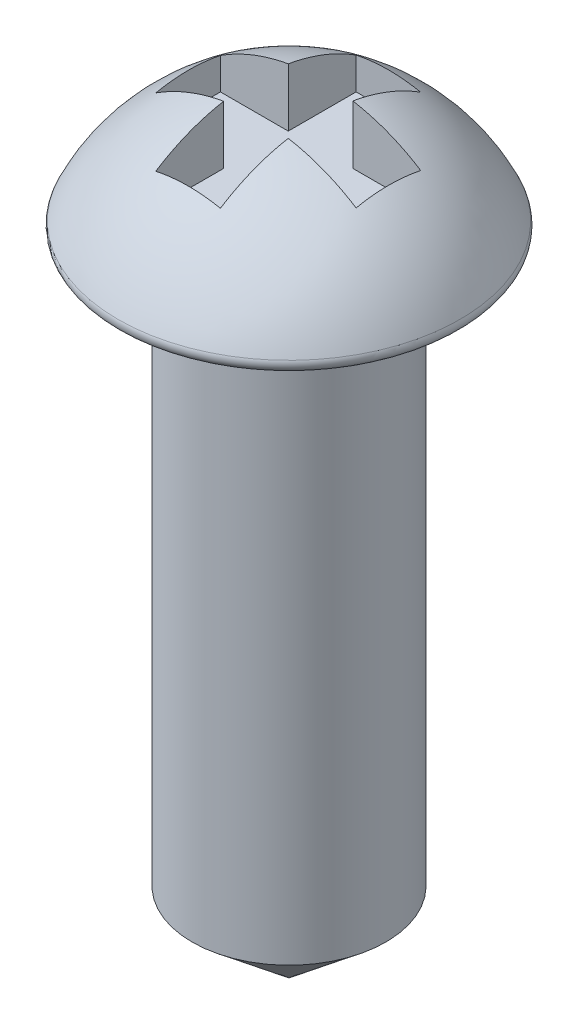
ISO-10303-21;
HEADER;
FILE_DESCRIPTION(('STEP AP214'),'2;1');
FILE_NAME('part.step','',(''),(''),'','','');
FILE_SCHEMA(('AUTOMOTIVE_DESIGN { 1 0 10303 214 1 1 1 1 }'));
ENDSEC;
DATA;
#1=APPLICATION_CONTEXT('core data for automotive mechanical design processes');
#2=APPLICATION_PROTOCOL_DEFINITION('international standard','automotive_design',2000,#1);
#3=PRODUCT_CONTEXT('',#1,'mechanical');
#4=PRODUCT('Part','Part','',(#3));
#5=PRODUCT_RELATED_PRODUCT_CATEGORY('part','',(#4));
#6=PRODUCT_DEFINITION_FORMATION('','',#4);
#7=PRODUCT_DEFINITION_CONTEXT('part definition',#1,'design');
#8=PRODUCT_DEFINITION('design','',#6,#7);
#9=PRODUCT_DEFINITION_SHAPE('','',#8);
#10=(LENGTH_UNIT() NAMED_UNIT(*) SI_UNIT(.MILLI.,.METRE.));
#11=(NAMED_UNIT(*) PLANE_ANGLE_UNIT() SI_UNIT($,.RADIAN.));
#12=(NAMED_UNIT(*) SI_UNIT($,.STERADIAN.) SOLID_ANGLE_UNIT());
#13=UNCERTAINTY_MEASURE_WITH_UNIT(LENGTH_MEASURE(1.E-05),#10,'distance_accuracy_value','');
#14=(GEOMETRIC_REPRESENTATION_CONTEXT(3) GLOBAL_UNCERTAINTY_ASSIGNED_CONTEXT((#13)) GLOBAL_UNIT_ASSIGNED_CONTEXT((#10,
#11,#12)) REPRESENTATION_CONTEXT('',''));
#15=CARTESIAN_POINT('',(0.,0.,0.));
#16=DIRECTION('',(0.,0.,1.));
#17=DIRECTION('',(1.,0.,0.));
#18=AXIS2_PLACEMENT_3D('',#15,#16,#17);
#19=CARTESIAN_POINT('',(0.,-0.755577662527332,0.));
#20=DIRECTION('',(0.,1.,0.));
#21=DIRECTION('',(1.,0.,0.));
#22=AXIS2_PLACEMENT_3D('',#19,#20,#21);
#23=SPHERICAL_SURFACE('',#22,2.13796576308188);
#24=CARTESIAN_POINT('',(0.,-0.755577662527332,0.370388630185053));
#25=DIRECTION('',(0.,0.,1.));
#26=DIRECTION('',(1.,0.,0.));
#27=AXIS2_PLACEMENT_3D('',#24,#25,#26);
#28=CIRCLE('',#27,2.10563763899202);
#29=CARTESIAN_POINT('',(1.13232028828451,1.01968587607171,0.370388630185053));
#30=VERTEX_POINT('',#29);
#31=CARTESIAN_POINT('',(0.361948002760647,1.31871824453065,0.370388630185053));
#32=VERTEX_POINT('',#31);
#33=EDGE_CURVE('E211',#30,#32,#28,.T.);
#34=ORIENTED_EDGE('',*,*,#33,.T.);
#35=CARTESIAN_POINT('',(0.361948002760647,-0.755577662527332,0.));
#36=DIRECTION('',(1.,0.,0.));
#37=DIRECTION('',(0.,0.,-1.));
#38=AXIS2_PLACEMENT_3D('',#35,#36,#37);
#39=CIRCLE('',#38,2.10710494456442);
#40=CARTESIAN_POINT('',(0.361948002760647,1.01601929519155,1.14076091570892));
#41=VERTEX_POINT('',#40);
#42=EDGE_CURVE('E11',#32,#41,#39,.T.);
#43=ORIENTED_EDGE('',*,*,#42,.T.);
#44=CARTESIAN_POINT('',(0.,-0.755577662527332,1.14076091570892));
#45=DIRECTION('',(0.,0.,1.));
#46=DIRECTION('',(1.,0.,0.));
#47=AXIS2_PLACEMENT_3D('',#44,#45,#46);
#48=CIRCLE('',#47,1.8081930586365);
#49=CARTESIAN_POINT('',(-0.371599949500931,1.01401992303616,1.14076091570892));
#50=VERTEX_POINT('',#49);
#51=EDGE_CURVE('E41',#41,#50,#48,.T.);
#52=ORIENTED_EDGE('',*,*,#51,.T.);
#53=CARTESIAN_POINT('',(-0.371599949500931,-0.755577662527332,0.));
#54=DIRECTION('',(-1.,0.,0.));
#55=DIRECTION('',(0.,0.,1.));
#56=AXIS2_PLACEMENT_3D('',#53,#54,#55);
#57=CIRCLE('',#56,2.10542420467733);
#58=CARTESIAN_POINT('',(-0.371599949500931,1.31701089873388,0.370388630185053));
#59=VERTEX_POINT('',#58);
#60=EDGE_CURVE('E237',#50,#59,#57,.T.);
#61=ORIENTED_EDGE('',*,*,#60,.T.);
#62=CARTESIAN_POINT('',(0.,-0.755577662527332,0.370388630185053));
#63=DIRECTION('',(0.,0.,1.));
#64=DIRECTION('',(1.,0.,0.));
#65=AXIS2_PLACEMENT_3D('',#62,#63,#64);
#66=CIRCLE('',#65,2.10563763899202);
#67=CARTESIAN_POINT('',(-1.14197223502479,1.01349251165242,0.370388630185054));
#68=VERTEX_POINT('',#67);
#69=EDGE_CURVE('E234',#59,#68,#66,.T.);
#70=ORIENTED_EDGE('',*,*,#69,.T.);
#71=CARTESIAN_POINT('',(-1.14197223502479,-0.755577662527332,0.));
#72=DIRECTION('',(-1.,0.,0.));
#73=DIRECTION('',(0.,0.,1.));
#74=AXIS2_PLACEMENT_3D('',#71,#72,#73);
#75=CIRCLE('',#74,1.80742828863077);
#76=CARTESIAN_POINT('',(-1.14197223502479,1.01499069970319,-0.363159322076525));
#77=VERTEX_POINT('',#76);
#78=EDGE_CURVE('E231',#68,#77,#75,.T.);
#79=ORIENTED_EDGE('',*,*,#78,.T.);
#80=CARTESIAN_POINT('',(0.,-0.755577662527332,-0.363159322076525));
#81=DIRECTION('',(0.,0.,-1.));
#82=DIRECTION('',(-1.,0.,0.));
#83=AXIS2_PLACEMENT_3D('',#80,#81,#82);
#84=CIRCLE('',#83,2.10689651167284);
#85=CARTESIAN_POINT('',(-0.371599949500931,1.31828983286144,-0.363159322076525));
#86=VERTEX_POINT('',#85);
#87=EDGE_CURVE('E228',#77,#86,#84,.T.);
#88=ORIENTED_EDGE('',*,*,#87,.T.);
#89=CARTESIAN_POINT('',(-0.371599949500931,-0.755577662527332,0.));
#90=DIRECTION('',(-1.,0.,0.));
#91=DIRECTION('',(0.,0.,1.));
#92=AXIS2_PLACEMENT_3D('',#89,#90,#91);
#93=CIRCLE('',#92,2.10542420467733);
#94=CARTESIAN_POINT('',(-0.371599949500931,1.01865940624675,-1.13353160760039));
#95=VERTEX_POINT('',#94);
#96=EDGE_CURVE('E225',#86,#95,#93,.T.);
#97=ORIENTED_EDGE('',*,*,#96,.T.);
#98=CARTESIAN_POINT('',(0.,-0.755577662527332,-1.13353160760039));
#99=DIRECTION('',(0.,0.,-1.));
#100=DIRECTION('',(-1.,0.,0.));
#101=AXIS2_PLACEMENT_3D('',#98,#99,#100);
#102=CIRCLE('',#101,1.81273376387189);
#103=CARTESIAN_POINT('',(0.361948002760647,1.0206535560866,-1.13353160760039));
#104=VERTEX_POINT('',#103);
#105=EDGE_CURVE('E222',#95,#104,#102,.T.);
#106=ORIENTED_EDGE('',*,*,#105,.T.);
#107=CARTESIAN_POINT('',(0.361948002760647,-0.755577662527332,0.));
#108=DIRECTION('',(1.,0.,0.));
#109=DIRECTION('',(0.,0.,-1.));
#110=AXIS2_PLACEMENT_3D('',#107,#108,#109);
#111=CIRCLE('',#110,2.10710494456442);
#112=CARTESIAN_POINT('',(0.361948002760647,1.31999612662033,-0.363159322076525));
#113=VERTEX_POINT('',#112);
#114=EDGE_CURVE('E219',#104,#113,#111,.T.);
#115=ORIENTED_EDGE('',*,*,#114,.T.);
#116=CARTESIAN_POINT('',(0.,-0.755577662527332,-0.363159322076525));
#117=DIRECTION('',(0.,0.,-1.));
#118=DIRECTION('',(-1.,0.,0.));
#119=AXIS2_PLACEMENT_3D('',#116,#117,#118);
#120=CIRCLE('',#119,2.10689651167284);
#121=CARTESIAN_POINT('',(1.13232028828451,1.02117884179127,-0.363159322076525));
#122=VERTEX_POINT('',#121);
#123=EDGE_CURVE('E216',#113,#122,#120,.T.);
#124=ORIENTED_EDGE('',*,*,#123,.T.);
#125=CARTESIAN_POINT('',(1.13232028828451,-0.755577662527332,0.));
#126=DIRECTION('',(1.,0.,0.));
#127=DIRECTION('',(0.,0.,-1.));
#128=AXIS2_PLACEMENT_3D('',#125,#126,#127);
#129=CIRCLE('',#128,1.81349065860554);
#130=EDGE_CURVE('E213',#122,#30,#129,.T.);
#131=ORIENTED_EDGE('',*,*,#130,.T.);
#132=EDGE_LOOP('',(#34,#43,#52,#61,#70,#79,#88,#97,#106,#115,#124,#131));
#133=FACE_BOUND('',#132,.T.);
#134=CARTESIAN_POINT('',(0.,0.141981944840599,0.));
#135=DIRECTION('',(0.,-1.,0.));
#136=DIRECTION('',(0.,0.,-1.));
#137=AXIS2_PLACEMENT_3D('',#134,#135,#136);
#138=CIRCLE('',#137,1.94043406363932);
#139=CARTESIAN_POINT('',(0.,0.141981944840599,-1.94043406363932));
#140=VERTEX_POINT('',#139);
#141=EDGE_CURVE('E205',#140,#140,#138,.F.);
#142=ORIENTED_EDGE('',*,*,#141,.T.);
#143=EDGE_LOOP('',(#142));
#144=FACE_BOUND('',#143,.T.);
#145=ADVANCED_FACE('F34',(#133,#144),#23,.T.);
#146=CARTESIAN_POINT('',(0.,-7.3028893114571,0.));
#147=DIRECTION('',(0.,1.,0.));
#148=DIRECTION('',(0.,0.,1.));
#149=AXIS2_PLACEMENT_3D('',#146,#147,#148);
#150=CONICAL_SURFACE('',#149,0.,0.883495452599122);
#151=CARTESIAN_POINT('',(0.,-6.4,0.));
#152=DIRECTION('',(0.,1.,0.));
#153=DIRECTION('',(0.,0.,1.));
#154=AXIS2_PLACEMENT_3D('',#151,#152,#153);
#155=CIRCLE('',#154,1.1);
#156=CARTESIAN_POINT('',(0.,-6.4,1.1));
#157=VERTEX_POINT('',#156);
#158=EDGE_CURVE('E202',#157,#157,#155,.T.);
#159=ORIENTED_EDGE('',*,*,#158,.F.);
#160=EDGE_LOOP('',(#159));
#161=FACE_BOUND('',#160,.T.);
#162=CARTESIAN_POINT('',(0.,-7.3028893114571,0.));
#163=VERTEX_POINT('',#162);
#164=VERTEX_LOOP('',#163);
#165=FACE_BOUND('',#164,.T.);
#166=ADVANCED_FACE('F279',(#161,#165),#150,.T.);
#167=CARTESIAN_POINT('',(0.,3.8000547936802,0.));
#168=DIRECTION('',(0.,1.,0.));
#169=DIRECTION('',(0.,0.,1.));
#170=AXIS2_PLACEMENT_3D('',#167,#168,#169);
#171=CYLINDRICAL_SURFACE('',#170,1.1);
#172=CARTESIAN_POINT('',(0.,0.,0.));
#173=DIRECTION('',(0.,1.,0.));
#174=DIRECTION('',(0.,0.,1.));
#175=AXIS2_PLACEMENT_3D('',#172,#173,#174);
#176=CIRCLE('',#175,1.1);
#177=CARTESIAN_POINT('',(0.,0.,1.1));
#178=VERTEX_POINT('',#177);
#179=EDGE_CURVE('E171',#178,#178,#176,.T.);
#180=ORIENTED_EDGE('',*,*,#179,.F.);
#181=EDGE_LOOP('',(#180));
#182=FACE_BOUND('',#181,.T.);
#183=ORIENTED_EDGE('',*,*,#158,.T.);
#184=EDGE_LOOP('',(#183));
#185=FACE_BOUND('',#184,.T.);
#186=ADVANCED_FACE('F283',(#182,#185),#171,.T.);
#187=CARTESIAN_POINT('',(2.,0.,0.));
#188=DIRECTION('',(0.,1.,0.));
#189=DIRECTION('',(0.,0.,1.));
#190=AXIS2_PLACEMENT_3D('',#187,#188,#189);
#191=PLANE('',#190);
#192=CARTESIAN_POINT('',(0.,0.,0.));
#193=DIRECTION('',(0.,1.,0.));
#194=DIRECTION('',(0.,0.,1.));
#195=AXIS2_PLACEMENT_3D('',#192,#193,#194);
#196=CIRCLE('',#195,1.84967329949863);
#197=CARTESIAN_POINT('',(0.,0.,1.84967329949863));
#198=VERTEX_POINT('',#197);
#199=EDGE_CURVE('E208',#198,#198,#196,.F.);
#200=ORIENTED_EDGE('',*,*,#199,.T.);
#201=EDGE_LOOP('',(#200));
#202=FACE_BOUND('',#201,.T.);
#203=ORIENTED_EDGE('',*,*,#179,.T.);
#204=EDGE_LOOP('',(#203));
#205=FACE_BOUND('',#204,.T.);
#206=ADVANCED_FACE('F288',(#202,#205),#191,.F.);
#207=CARTESIAN_POINT('',(0.,0.0999999999999999,0.));
#208=DIRECTION('',(0.,1.,0.));
#209=DIRECTION('',(0.,0.,1.));
#210=AXIS2_PLACEMENT_3D('',#207,#208,#209);
#211=TOROIDAL_SURFACE('',#210,1.84967329949863,0.1);
#212=ORIENTED_EDGE('',*,*,#199,.F.);
#213=EDGE_LOOP('',(#212));
#214=FACE_BOUND('',#213,.T.);
#215=ORIENTED_EDGE('',*,*,#141,.F.);
#216=EDGE_LOOP('',(#215));
#217=FACE_BOUND('',#216,.T.);
#218=ADVANCED_FACE('F295',(#214,#217),#211,.T.);
#219=CARTESIAN_POINT('',(0.361948002760647,0.656537419888082,1.14076091570892));
#220=DIRECTION('',(1.,0.,0.));
#221=DIRECTION('',(0.,0.,-1.));
#222=AXIS2_PLACEMENT_3D('',#219,#220,#221);
#223=PLANE('',#222);
#224=DIRECTION('',(0.,1.,0.));
#225=VECTOR('',#224,1.);
#226=CARTESIAN_POINT('',(0.361948002760647,0.656537419888082,0.370388630185053));
#227=LINE('',#226,#225);
#228=CARTESIAN_POINT('',(0.361948002760647,0.656537419888082,0.370388630185053));
#229=VERTEX_POINT('',#228);
#230=EDGE_CURVE('E48',#229,#32,#227,.T.);
#231=ORIENTED_EDGE('',*,*,#230,.F.);
#232=DIRECTION('',(0.,0.,-1.));
#233=VECTOR('',#232,1.);
#234=CARTESIAN_POINT('',(0.361948002760647,0.656537419888082,1.14076091570892));
#235=LINE('',#234,#233);
#236=CARTESIAN_POINT('',(0.361948002760647,0.656537419888082,1.14076091570892));
#237=VERTEX_POINT('',#236);
#238=EDGE_CURVE('E124',#237,#229,#235,.T.);
#239=ORIENTED_EDGE('',*,*,#238,.F.);
#240=DIRECTION('',(0.,1.,0.));
#241=VECTOR('',#240,1.);
#242=CARTESIAN_POINT('',(0.361948002760647,0.656537419888082,1.14076091570892));
#243=LINE('',#242,#241);
#244=EDGE_CURVE('E169',#237,#41,#243,.T.);
#245=ORIENTED_EDGE('',*,*,#244,.T.);
#246=ORIENTED_EDGE('',*,*,#42,.F.);
#247=EDGE_LOOP('',(#231,#239,#245,#246));
#248=FACE_BOUND('',#247,.T.);
#249=ADVANCED_FACE('F121',(#248),#223,.F.);
#250=CARTESIAN_POINT('',(0.361948002760647,0.656537419888082,1.14076091570892));
#251=DIRECTION('',(0.,0.,1.));
#252=DIRECTION('',(1.,0.,0.));
#253=AXIS2_PLACEMENT_3D('',#250,#251,#252);
#254=PLANE('',#253);
#255=ORIENTED_EDGE('',*,*,#244,.F.);
#256=DIRECTION('',(1.,0.,0.));
#257=VECTOR('',#256,1.);
#258=CARTESIAN_POINT('',(0.361948002760647,0.656537419888082,1.14076091570892));
#259=LINE('',#258,#257);
#260=CARTESIAN_POINT('',(-0.371599949500931,0.656537419888082,1.14076091570892));
#261=VERTEX_POINT('',#260);
#262=EDGE_CURVE('E128',#261,#237,#259,.T.);
#263=ORIENTED_EDGE('',*,*,#262,.F.);
#264=DIRECTION('',(0.,1.,0.));
#265=VECTOR('',#264,1.);
#266=CARTESIAN_POINT('',(-0.371599949500931,0.656537419888082,1.14076091570892));
#267=LINE('',#266,#265);
#268=EDGE_CURVE('E172',#261,#50,#267,.T.);
#269=ORIENTED_EDGE('',*,*,#268,.T.);
#270=ORIENTED_EDGE('',*,*,#51,.F.);
#271=EDGE_LOOP('',(#255,#263,#269,#270));
#272=FACE_BOUND('',#271,.T.);
#273=ADVANCED_FACE('F243',(#272),#254,.F.);
#274=CARTESIAN_POINT('',(-0.371599949500931,0.656537419888082,1.14076091570892));
#275=DIRECTION('',(-1.,0.,0.));
#276=DIRECTION('',(0.,0.,1.));
#277=AXIS2_PLACEMENT_3D('',#274,#275,#276);
#278=PLANE('',#277);
#279=ORIENTED_EDGE('',*,*,#268,.F.);
#280=DIRECTION('',(0.,0.,1.));
#281=VECTOR('',#280,1.);
#282=CARTESIAN_POINT('',(-0.371599949500931,0.656537419888082,1.14076091570892));
#283=LINE('',#282,#281);
#284=CARTESIAN_POINT('',(-0.371599949500931,0.656537419888082,0.370388630185053));
#285=VERTEX_POINT('',#284);
#286=EDGE_CURVE('E166',#285,#261,#283,.T.);
#287=ORIENTED_EDGE('',*,*,#286,.F.);
#288=DIRECTION('',(0.,1.,0.));
#289=VECTOR('',#288,1.);
#290=CARTESIAN_POINT('',(-0.371599949500931,0.656537419888082,0.370388630185053));
#291=LINE('',#290,#289);
#292=EDGE_CURVE('E175',#285,#59,#291,.T.);
#293=ORIENTED_EDGE('',*,*,#292,.T.);
#294=ORIENTED_EDGE('',*,*,#60,.F.);
#295=EDGE_LOOP('',(#279,#287,#293,#294));
#296=FACE_BOUND('',#295,.T.);
#297=ADVANCED_FACE('F246',(#296),#278,.F.);
#298=CARTESIAN_POINT('',(-0.371599949500931,0.656537419888082,0.370388630185053));
#299=DIRECTION('',(0.,0.,1.));
#300=DIRECTION('',(1.,0.,0.));
#301=AXIS2_PLACEMENT_3D('',#298,#299,#300);
#302=PLANE('',#301);
#303=ORIENTED_EDGE('',*,*,#292,.F.);
#304=DIRECTION('',(1.,0.,0.));
#305=VECTOR('',#304,1.);
#306=CARTESIAN_POINT('',(-0.371599949500931,0.656537419888082,0.370388630185053));
#307=LINE('',#306,#305);
#308=CARTESIAN_POINT('',(-1.14197223502479,0.656537419888082,0.370388630185054));
#309=VERTEX_POINT('',#308);
#310=EDGE_CURVE('E163',#309,#285,#307,.T.);
#311=ORIENTED_EDGE('',*,*,#310,.F.);
#312=DIRECTION('',(0.,1.,0.));
#313=VECTOR('',#312,1.);
#314=CARTESIAN_POINT('',(-1.14197223502479,0.656537419888082,0.370388630185054));
#315=LINE('',#314,#313);
#316=EDGE_CURVE('E178',#309,#68,#315,.T.);
#317=ORIENTED_EDGE('',*,*,#316,.T.);
#318=ORIENTED_EDGE('',*,*,#69,.F.);
#319=EDGE_LOOP('',(#303,#311,#317,#318));
#320=FACE_BOUND('',#319,.T.);
#321=ADVANCED_FACE('F250',(#320),#302,.F.);
#322=CARTESIAN_POINT('',(-1.14197223502479,0.656537419888082,0.370388630185054));
#323=DIRECTION('',(-1.,0.,0.));
#324=DIRECTION('',(0.,0.,1.));
#325=AXIS2_PLACEMENT_3D('',#322,#323,#324);
#326=PLANE('',#325);
#327=ORIENTED_EDGE('',*,*,#316,.F.);
#328=DIRECTION('',(0.,0.,1.));
#329=VECTOR('',#328,1.);
#330=CARTESIAN_POINT('',(-1.14197223502479,0.656537419888082,0.370388630185054));
#331=LINE('',#330,#329);
#332=CARTESIAN_POINT('',(-1.14197223502479,0.656537419888082,-0.363159322076525));
#333=VERTEX_POINT('',#332);
#334=EDGE_CURVE('E160',#333,#309,#331,.T.);
#335=ORIENTED_EDGE('',*,*,#334,.F.);
#336=DIRECTION('',(0.,1.,0.));
#337=VECTOR('',#336,1.);
#338=CARTESIAN_POINT('',(-1.14197223502479,0.656537419888082,-0.363159322076525));
#339=LINE('',#338,#337);
#340=EDGE_CURVE('E181',#333,#77,#339,.T.);
#341=ORIENTED_EDGE('',*,*,#340,.T.);
#342=ORIENTED_EDGE('',*,*,#78,.F.);
#343=EDGE_LOOP('',(#327,#335,#341,#342));
#344=FACE_BOUND('',#343,.T.);
#345=ADVANCED_FACE('F252',(#344),#326,.F.);
#346=CARTESIAN_POINT('',(-0.371599949500931,0.656537419888082,-0.363159322076525));
#347=DIRECTION('',(0.,0.,-1.));
#348=DIRECTION('',(-1.,0.,0.));
#349=AXIS2_PLACEMENT_3D('',#346,#347,#348);
#350=PLANE('',#349);
#351=ORIENTED_EDGE('',*,*,#340,.F.);
#352=DIRECTION('',(-1.,0.,0.));
#353=VECTOR('',#352,1.);
#354=CARTESIAN_POINT('',(-0.371599949500931,0.656537419888082,-0.363159322076525));
#355=LINE('',#354,#353);
#356=CARTESIAN_POINT('',(-0.371599949500931,0.656537419888082,-0.363159322076525));
#357=VERTEX_POINT('',#356);
#358=EDGE_CURVE('E157',#357,#333,#355,.T.);
#359=ORIENTED_EDGE('',*,*,#358,.F.);
#360=DIRECTION('',(0.,1.,0.));
#361=VECTOR('',#360,1.);
#362=CARTESIAN_POINT('',(-0.371599949500931,0.656537419888082,-0.363159322076525));
#363=LINE('',#362,#361);
#364=EDGE_CURVE('E184',#357,#86,#363,.T.);
#365=ORIENTED_EDGE('',*,*,#364,.T.);
#366=ORIENTED_EDGE('',*,*,#87,.F.);
#367=EDGE_LOOP('',(#351,#359,#365,#366));
#368=FACE_BOUND('',#367,.T.);
#369=ADVANCED_FACE('F255',(#368),#350,.F.);
#370=CARTESIAN_POINT('',(-0.371599949500931,0.656537419888082,-0.363159322076525));
#371=DIRECTION('',(-1.,0.,0.));
#372=DIRECTION('',(0.,0.,1.));
#373=AXIS2_PLACEMENT_3D('',#370,#371,#372);
#374=PLANE('',#373);
#375=ORIENTED_EDGE('',*,*,#364,.F.);
#376=DIRECTION('',(0.,0.,1.));
#377=VECTOR('',#376,1.);
#378=CARTESIAN_POINT('',(-0.371599949500931,0.656537419888082,-0.363159322076525));
#379=LINE('',#378,#377);
#380=CARTESIAN_POINT('',(-0.371599949500931,0.656537419888082,-1.13353160760039));
#381=VERTEX_POINT('',#380);
#382=EDGE_CURVE('E154',#381,#357,#379,.T.);
#383=ORIENTED_EDGE('',*,*,#382,.F.);
#384=DIRECTION('',(0.,1.,0.));
#385=VECTOR('',#384,1.);
#386=CARTESIAN_POINT('',(-0.371599949500931,0.656537419888082,-1.13353160760039));
#387=LINE('',#386,#385);
#388=EDGE_CURVE('E187',#381,#95,#387,.T.);
#389=ORIENTED_EDGE('',*,*,#388,.T.);
#390=ORIENTED_EDGE('',*,*,#96,.F.);
#391=EDGE_LOOP('',(#375,#383,#389,#390));
#392=FACE_BOUND('',#391,.T.);
#393=ADVANCED_FACE('F258',(#392),#374,.F.);
#394=CARTESIAN_POINT('',(0.361948002760647,0.656537419888082,-1.13353160760039));
#395=DIRECTION('',(0.,0.,-1.));
#396=DIRECTION('',(-1.,0.,0.));
#397=AXIS2_PLACEMENT_3D('',#394,#395,#396);
#398=PLANE('',#397);
#399=ORIENTED_EDGE('',*,*,#388,.F.);
#400=DIRECTION('',(-1.,0.,0.));
#401=VECTOR('',#400,1.);
#402=CARTESIAN_POINT('',(0.361948002760647,0.656537419888082,-1.13353160760039));
#403=LINE('',#402,#401);
#404=CARTESIAN_POINT('',(0.361948002760647,0.656537419888082,-1.13353160760039));
#405=VERTEX_POINT('',#404);
#406=EDGE_CURVE('E151',#405,#381,#403,.T.);
#407=ORIENTED_EDGE('',*,*,#406,.F.);
#408=DIRECTION('',(0.,1.,0.));
#409=VECTOR('',#408,1.);
#410=CARTESIAN_POINT('',(0.361948002760647,0.656537419888082,-1.13353160760039));
#411=LINE('',#410,#409);
#412=EDGE_CURVE('E190',#405,#104,#411,.T.);
#413=ORIENTED_EDGE('',*,*,#412,.T.);
#414=ORIENTED_EDGE('',*,*,#105,.F.);
#415=EDGE_LOOP('',(#399,#407,#413,#414));
#416=FACE_BOUND('',#415,.T.);
#417=ADVANCED_FACE('F260',(#416),#398,.F.);
#418=CARTESIAN_POINT('',(0.361948002760647,0.656537419888082,-0.363159322076525));
#419=DIRECTION('',(1.,0.,0.));
#420=DIRECTION('',(0.,0.,-1.));
#421=AXIS2_PLACEMENT_3D('',#418,#419,#420);
#422=PLANE('',#421);
#423=ORIENTED_EDGE('',*,*,#412,.F.);
#424=DIRECTION('',(0.,0.,-1.));
#425=VECTOR('',#424,1.);
#426=CARTESIAN_POINT('',(0.361948002760647,0.656537419888082,-0.363159322076525));
#427=LINE('',#426,#425);
#428=CARTESIAN_POINT('',(0.361948002760647,0.656537419888082,-0.363159322076525));
#429=VERTEX_POINT('',#428);
#430=EDGE_CURVE('E148',#429,#405,#427,.T.);
#431=ORIENTED_EDGE('',*,*,#430,.F.);
#432=DIRECTION('',(0.,1.,0.));
#433=VECTOR('',#432,1.);
#434=CARTESIAN_POINT('',(0.361948002760647,0.656537419888082,-0.363159322076525));
#435=LINE('',#434,#433);
#436=EDGE_CURVE('E193',#429,#113,#435,.T.);
#437=ORIENTED_EDGE('',*,*,#436,.T.);
#438=ORIENTED_EDGE('',*,*,#114,.F.);
#439=EDGE_LOOP('',(#423,#431,#437,#438));
#440=FACE_BOUND('',#439,.T.);
#441=ADVANCED_FACE('F264',(#440),#422,.F.);
#442=CARTESIAN_POINT('',(1.13232028828451,0.656537419888082,-0.363159322076525));
#443=DIRECTION('',(0.,0.,-1.));
#444=DIRECTION('',(-1.,0.,0.));
#445=AXIS2_PLACEMENT_3D('',#442,#443,#444);
#446=PLANE('',#445);
#447=ORIENTED_EDGE('',*,*,#436,.F.);
#448=DIRECTION('',(-1.,0.,0.));
#449=VECTOR('',#448,1.);
#450=CARTESIAN_POINT('',(1.13232028828451,0.656537419888082,-0.363159322076525));
#451=LINE('',#450,#449);
#452=CARTESIAN_POINT('',(1.13232028828451,0.656537419888082,-0.363159322076525));
#453=VERTEX_POINT('',#452);
#454=EDGE_CURVE('E145',#453,#429,#451,.T.);
#455=ORIENTED_EDGE('',*,*,#454,.F.);
#456=DIRECTION('',(0.,1.,0.));
#457=VECTOR('',#456,1.);
#458=CARTESIAN_POINT('',(1.13232028828451,0.656537419888082,-0.363159322076525));
#459=LINE('',#458,#457);
#460=EDGE_CURVE('E196',#453,#122,#459,.T.);
#461=ORIENTED_EDGE('',*,*,#460,.T.);
#462=ORIENTED_EDGE('',*,*,#123,.F.);
#463=EDGE_LOOP('',(#447,#455,#461,#462));
#464=FACE_BOUND('',#463,.T.);
#465=ADVANCED_FACE('F267',(#464),#446,.F.);
#466=CARTESIAN_POINT('',(1.13232028828451,0.656537419888082,0.370388630185053));
#467=DIRECTION('',(1.,0.,0.));
#468=DIRECTION('',(0.,0.,-1.));
#469=AXIS2_PLACEMENT_3D('',#466,#467,#468);
#470=PLANE('',#469);
#471=ORIENTED_EDGE('',*,*,#460,.F.);
#472=DIRECTION('',(0.,0.,-1.));
#473=VECTOR('',#472,1.);
#474=CARTESIAN_POINT('',(1.13232028828451,0.656537419888082,0.370388630185053));
#475=LINE('',#474,#473);
#476=CARTESIAN_POINT('',(1.13232028828451,0.656537419888082,0.370388630185053));
#477=VERTEX_POINT('',#476);
#478=EDGE_CURVE('E137',#477,#453,#475,.T.);
#479=ORIENTED_EDGE('',*,*,#478,.F.);
#480=DIRECTION('',(0.,1.,0.));
#481=VECTOR('',#480,1.);
#482=CARTESIAN_POINT('',(1.13232028828451,0.656537419888082,0.370388630185053));
#483=LINE('',#482,#481);
#484=EDGE_CURVE('E127',#477,#30,#483,.T.);
#485=ORIENTED_EDGE('',*,*,#484,.T.);
#486=ORIENTED_EDGE('',*,*,#130,.F.);
#487=EDGE_LOOP('',(#471,#479,#485,#486));
#488=FACE_BOUND('',#487,.T.);
#489=ADVANCED_FACE('F269',(#488),#470,.F.);
#490=CARTESIAN_POINT('',(1.13232028828451,0.656537419888082,0.370388630185053));
#491=DIRECTION('',(0.,0.,1.));
#492=DIRECTION('',(1.,0.,0.));
#493=AXIS2_PLACEMENT_3D('',#490,#491,#492);
#494=PLANE('',#493);
#495=ORIENTED_EDGE('',*,*,#484,.F.);
#496=DIRECTION('',(1.,0.,0.));
#497=VECTOR('',#496,1.);
#498=CARTESIAN_POINT('',(1.13232028828451,0.656537419888082,0.370388630185053));
#499=LINE('',#498,#497);
#500=EDGE_CURVE('E131',#229,#477,#499,.T.);
#501=ORIENTED_EDGE('',*,*,#500,.F.);
#502=ORIENTED_EDGE('',*,*,#230,.T.);
#503=ORIENTED_EDGE('',*,*,#33,.F.);
#504=EDGE_LOOP('',(#495,#501,#502,#503));
#505=FACE_BOUND('',#504,.T.);
#506=ADVANCED_FACE('F132',(#505),#494,.F.);
#507=CARTESIAN_POINT('',(0.361948002760647,0.656537419888082,-1.13353160760039));
#508=DIRECTION('',(0.,1.,0.));
#509=DIRECTION('',(0.,0.,1.));
#510=AXIS2_PLACEMENT_3D('',#507,#508,#509);
#511=PLANE('',#510);
#512=ORIENTED_EDGE('',*,*,#238,.T.);
#513=ORIENTED_EDGE('',*,*,#500,.T.);
#514=ORIENTED_EDGE('',*,*,#478,.T.);
#515=ORIENTED_EDGE('',*,*,#454,.T.);
#516=ORIENTED_EDGE('',*,*,#430,.T.);
#517=ORIENTED_EDGE('',*,*,#406,.T.);
#518=ORIENTED_EDGE('',*,*,#382,.T.);
#519=ORIENTED_EDGE('',*,*,#358,.T.);
#520=ORIENTED_EDGE('',*,*,#334,.T.);
#521=ORIENTED_EDGE('',*,*,#310,.T.);
#522=ORIENTED_EDGE('',*,*,#286,.T.);
#523=ORIENTED_EDGE('',*,*,#262,.T.);
#524=EDGE_LOOP('',(#512,#513,#514,#515,#516,#517,#518,#519,#520,#521,#522,#523));
#525=FACE_BOUND('',#524,.T.);
#526=ADVANCED_FACE('F139',(#525),#511,.T.);
#527=CLOSED_SHELL('',(#145,#166,#186,#206,#218,#249,#273,#297,#321,#345,#369,#393,#417,#441,
#465,#489,#506,#526));
#528=MANIFOLD_SOLID_BREP('B2',#527);
#529=ADVANCED_BREP_SHAPE_REPRESENTATION('',(#18,#528),#14);
#530=SHAPE_DEFINITION_REPRESENTATION(#9,#529);
ENDSEC;
END-ISO-10303-21;
